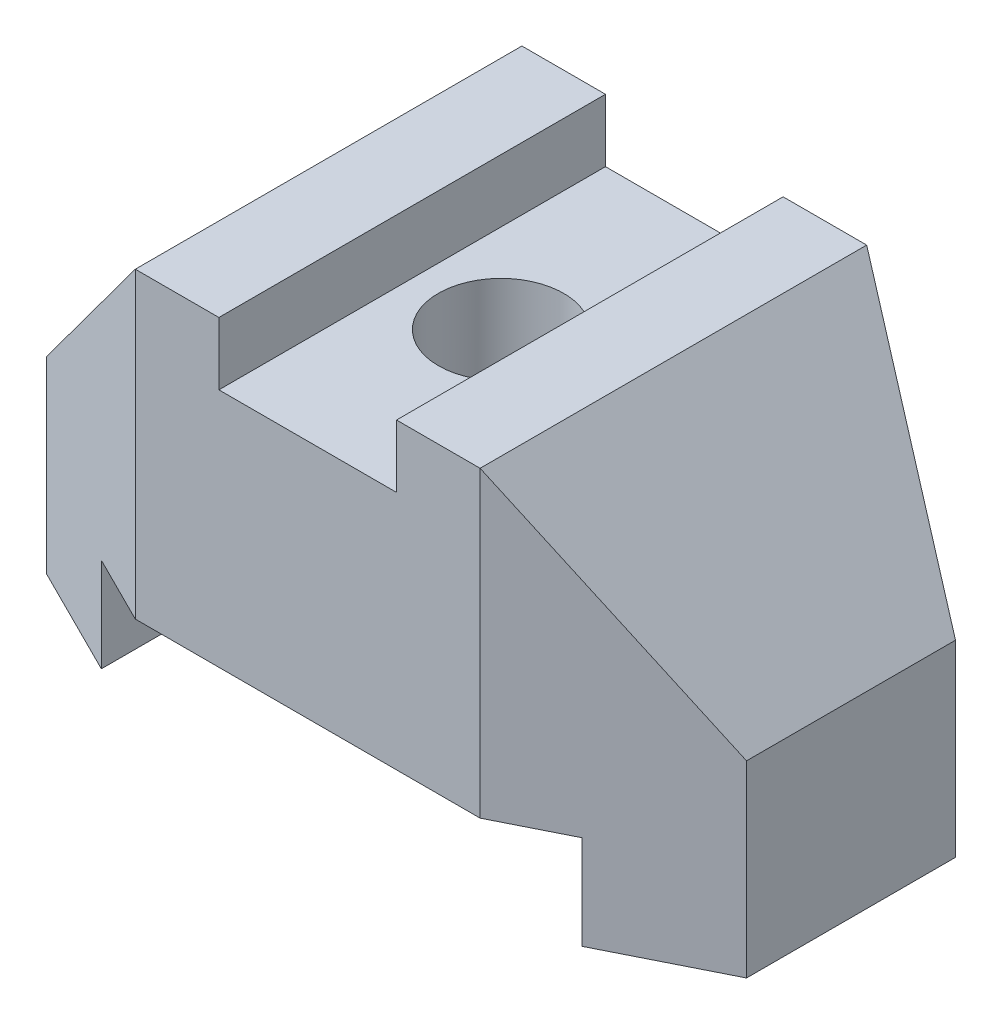
ISO-10303-21;
HEADER;
FILE_DESCRIPTION(('STEP AP214'),'2;1');
FILE_NAME('part.step','',(''),(''),'','','');
FILE_SCHEMA(('AUTOMOTIVE_DESIGN { 1 0 10303 214 1 1 1 1 }'));
ENDSEC;
DATA;
#1=APPLICATION_CONTEXT('core data for automotive mechanical design processes');
#2=APPLICATION_PROTOCOL_DEFINITION('international standard','automotive_design',2000,#1);
#3=PRODUCT_CONTEXT('',#1,'mechanical');
#4=PRODUCT('Part','Part','',(#3));
#5=PRODUCT_RELATED_PRODUCT_CATEGORY('part','',(#4));
#6=PRODUCT_DEFINITION_FORMATION('','',#4);
#7=PRODUCT_DEFINITION_CONTEXT('part definition',#1,'design');
#8=PRODUCT_DEFINITION('design','',#6,#7);
#9=PRODUCT_DEFINITION_SHAPE('','',#8);
#10=(LENGTH_UNIT() NAMED_UNIT(*) SI_UNIT(.MILLI.,.METRE.));
#11=(NAMED_UNIT(*) PLANE_ANGLE_UNIT() SI_UNIT($,.RADIAN.));
#12=(NAMED_UNIT(*) SI_UNIT($,.STERADIAN.) SOLID_ANGLE_UNIT());
#13=UNCERTAINTY_MEASURE_WITH_UNIT(LENGTH_MEASURE(1.E-05),#10,'distance_accuracy_value','');
#14=(GEOMETRIC_REPRESENTATION_CONTEXT(3) GLOBAL_UNCERTAINTY_ASSIGNED_CONTEXT((#13)) GLOBAL_UNIT_ASSIGNED_CONTEXT((#10,
#11,#12)) REPRESENTATION_CONTEXT('',''));
#15=CARTESIAN_POINT('',(0.,0.,0.));
#16=DIRECTION('',(0.,0.,1.));
#17=DIRECTION('',(1.,0.,0.));
#18=AXIS2_PLACEMENT_3D('',#15,#16,#17);
#19=CARTESIAN_POINT('',(0.,38.,0.));
#20=DIRECTION('',(0.,1.,0.));
#21=DIRECTION('',(0.,0.,1.));
#22=AXIS2_PLACEMENT_3D('',#19,#20,#21);
#23=PLANE('',#22);
#24=DIRECTION('',(0.,0.,-1.));
#25=VECTOR('',#24,1.);
#26=CARTESIAN_POINT('',(8.5,38.,-18.5));
#27=LINE('',#26,#25);
#28=CARTESIAN_POINT('',(8.49999999999999,38.,18.5));
#29=VERTEX_POINT('',#28);
#30=CARTESIAN_POINT('',(8.5,38.,-18.5));
#31=VERTEX_POINT('',#30);
#32=EDGE_CURVE('E172',#29,#31,#27,.T.);
#33=ORIENTED_EDGE('',*,*,#32,.F.);
#34=DIRECTION('',(1.,0.,0.));
#35=VECTOR('',#34,1.);
#36=CARTESIAN_POINT('',(0.,38.,18.5));
#37=LINE('',#36,#35);
#38=CARTESIAN_POINT('',(16.5,38.,18.5));
#39=VERTEX_POINT('',#38);
#40=EDGE_CURVE('E256',#29,#39,#37,.T.);
#41=ORIENTED_EDGE('',*,*,#40,.T.);
#42=DIRECTION('',(0.,0.,-1.));
#43=VECTOR('',#42,1.);
#44=CARTESIAN_POINT('',(16.5,38.,119.314675957941));
#45=LINE('',#44,#43);
#46=CARTESIAN_POINT('',(16.5,38.,-18.5));
#47=VERTEX_POINT('',#46);
#48=EDGE_CURVE('E238',#39,#47,#45,.T.);
#49=ORIENTED_EDGE('',*,*,#48,.T.);
#50=DIRECTION('',(1.,0.,0.));
#51=VECTOR('',#50,1.);
#52=CARTESIAN_POINT('',(0.,38.,-18.5));
#53=LINE('',#52,#51);
#54=EDGE_CURVE('E255',#31,#47,#53,.T.);
#55=ORIENTED_EDGE('',*,*,#54,.F.);
#56=EDGE_LOOP('',(#33,#41,#49,#55));
#57=FACE_BOUND('',#56,.T.);
#58=ADVANCED_FACE('F41',(#57),#23,.T.);
#59=CARTESIAN_POINT('',(0.,0.,0.));
#60=DIRECTION('',(0.,1.,0.));
#61=DIRECTION('',(0.,0.,1.));
#62=AXIS2_PLACEMENT_3D('',#59,#60,#61);
#63=PLANE('',#62);
#64=DIRECTION('',(0.894427190999916,0.,-0.447213595499958));
#65=VECTOR('',#64,1.);
#66=CARTESIAN_POINT('',(-10.7,0.,-21.4));
#67=LINE('',#66,#65);
#68=CARTESIAN_POINT('',(-33.5,0.,-10.));
#69=VERTEX_POINT('',#68);
#70=CARTESIAN_POINT('',(-23.,0.,-15.25));
#71=VERTEX_POINT('',#70);
#72=EDGE_CURVE('E279',#69,#71,#67,.T.);
#73=ORIENTED_EDGE('',*,*,#72,.T.);
#74=DIRECTION('',(0.,0.,1.));
#75=VECTOR('',#74,1.);
#76=CARTESIAN_POINT('',(-23.,0.,0.));
#77=LINE('',#76,#75);
#78=CARTESIAN_POINT('',(-23.,0.,15.25));
#79=VERTEX_POINT('',#78);
#80=EDGE_CURVE('E50',#71,#79,#77,.T.);
#81=ORIENTED_EDGE('',*,*,#80,.T.);
#82=DIRECTION('',(0.894427190999916,0.,0.447213595499958));
#83=VECTOR('',#82,1.);
#84=CARTESIAN_POINT('',(-10.7,0.,21.4));
#85=LINE('',#84,#83);
#86=CARTESIAN_POINT('',(-33.5,0.,10.));
#87=VERTEX_POINT('',#86);
#88=EDGE_CURVE('E263',#87,#79,#85,.T.);
#89=ORIENTED_EDGE('',*,*,#88,.F.);
#90=DIRECTION('',(0.,0.,-1.));
#91=VECTOR('',#90,1.);
#92=CARTESIAN_POINT('',(-33.5,0.,0.));
#93=LINE('',#92,#91);
#94=EDGE_CURVE('E250',#87,#69,#93,.T.);
#95=ORIENTED_EDGE('',*,*,#94,.T.);
#96=EDGE_LOOP('',(#73,#81,#89,#95));
#97=FACE_BOUND('',#96,.T.);
#98=ADVANCED_FACE('F324',(#97),#63,.F.);
#99=CARTESIAN_POINT('',(-33.5,38.,0.));
#100=DIRECTION('',(-1.,0.,0.));
#101=DIRECTION('',(0.,0.,1.));
#102=AXIS2_PLACEMENT_3D('',#99,#100,#101);
#103=PLANE('',#102);
#104=DIRECTION('',(0.,-1.,0.));
#105=VECTOR('',#104,1.);
#106=CARTESIAN_POINT('',(-33.5,38.,10.));
#107=LINE('',#106,#105);
#108=CARTESIAN_POINT('',(-33.5,18.,10.));
#109=VERTEX_POINT('',#108);
#110=EDGE_CURVE('E307',#109,#87,#107,.T.);
#111=ORIENTED_EDGE('',*,*,#110,.F.);
#112=DIRECTION('',(0.,0.,-1.));
#113=VECTOR('',#112,1.);
#114=CARTESIAN_POINT('',(-33.5,18.,119.314675957941));
#115=LINE('',#114,#113);
#116=CARTESIAN_POINT('',(-33.5,18.,-10.));
#117=VERTEX_POINT('',#116);
#118=EDGE_CURVE('E228',#109,#117,#115,.T.);
#119=ORIENTED_EDGE('',*,*,#118,.T.);
#120=DIRECTION('',(0.,-1.,0.));
#121=VECTOR('',#120,1.);
#122=CARTESIAN_POINT('',(-33.5,38.,-10.));
#123=LINE('',#122,#121);
#124=EDGE_CURVE('E259',#117,#69,#123,.T.);
#125=ORIENTED_EDGE('',*,*,#124,.T.);
#126=ORIENTED_EDGE('',*,*,#94,.F.);
#127=EDGE_LOOP('',(#111,#119,#125,#126));
#128=FACE_BOUND('',#127,.T.);
#129=ADVANCED_FACE('F43',(#128),#103,.T.);
#130=CARTESIAN_POINT('',(33.5,38.,0.));
#131=DIRECTION('',(-1.,0.,0.));
#132=DIRECTION('',(0.,0.,1.));
#133=AXIS2_PLACEMENT_3D('',#130,#131,#132);
#134=PLANE('',#133);
#135=DIRECTION('',(0.,0.,-1.));
#136=VECTOR('',#135,1.);
#137=CARTESIAN_POINT('',(33.5,18.,119.314675957941));
#138=LINE('',#137,#136);
#139=CARTESIAN_POINT('',(33.5,18.,10.));
#140=VERTEX_POINT('',#139);
#141=CARTESIAN_POINT('',(33.5,18.,-10.));
#142=VERTEX_POINT('',#141);
#143=EDGE_CURVE('E239',#140,#142,#138,.T.);
#144=ORIENTED_EDGE('',*,*,#143,.F.);
#145=DIRECTION('',(0.,-1.,0.));
#146=VECTOR('',#145,1.);
#147=CARTESIAN_POINT('',(33.5,38.,10.));
#148=LINE('',#147,#146);
#149=CARTESIAN_POINT('',(33.5,0.,10.));
#150=VERTEX_POINT('',#149);
#151=EDGE_CURVE('E296',#140,#150,#148,.T.);
#152=ORIENTED_EDGE('',*,*,#151,.T.);
#153=DIRECTION('',(0.,0.,-1.));
#154=VECTOR('',#153,1.);
#155=CARTESIAN_POINT('',(33.5,0.,0.));
#156=LINE('',#155,#154);
#157=CARTESIAN_POINT('',(33.5,0.,-10.));
#158=VERTEX_POINT('',#157);
#159=EDGE_CURVE('E271',#150,#158,#156,.T.);
#160=ORIENTED_EDGE('',*,*,#159,.T.);
#161=DIRECTION('',(0.,-1.,0.));
#162=VECTOR('',#161,1.);
#163=CARTESIAN_POINT('',(33.5,38.,-10.));
#164=LINE('',#163,#162);
#165=EDGE_CURVE('E293',#142,#158,#164,.T.);
#166=ORIENTED_EDGE('',*,*,#165,.F.);
#167=EDGE_LOOP('',(#144,#152,#160,#166));
#168=FACE_BOUND('',#167,.T.);
#169=ADVANCED_FACE('F381',(#168),#134,.F.);
#170=DIRECTION('',(0.,0.,1.));
#171=VECTOR('',#170,1.);
#172=CARTESIAN_POINT('',(-8.5,38.,-18.5));
#173=LINE('',#172,#171);
#174=CARTESIAN_POINT('',(-8.5,38.,-18.5));
#175=VERTEX_POINT('',#174);
#176=CARTESIAN_POINT('',(-8.49999999999999,38.,18.5));
#177=VERTEX_POINT('',#176);
#178=EDGE_CURVE('E343',#175,#177,#173,.T.);
#179=ORIENTED_EDGE('',*,*,#178,.F.);
#180=CARTESIAN_POINT('',(-16.5,38.,-18.5));
#181=VERTEX_POINT('',#180);
#182=EDGE_CURVE('E178',#181,#175,#53,.T.);
#183=ORIENTED_EDGE('',*,*,#182,.F.);
#184=DIRECTION('',(0.,0.,-1.));
#185=VECTOR('',#184,1.);
#186=CARTESIAN_POINT('',(-16.5,38.,119.314675957941));
#187=LINE('',#186,#185);
#188=CARTESIAN_POINT('',(-16.5,38.,18.5));
#189=VERTEX_POINT('',#188);
#190=EDGE_CURVE('E227',#189,#181,#187,.T.);
#191=ORIENTED_EDGE('',*,*,#190,.F.);
#192=EDGE_CURVE('E251',#189,#177,#37,.T.);
#193=ORIENTED_EDGE('',*,*,#192,.T.);
#194=EDGE_LOOP('',(#179,#183,#191,#193));
#195=FACE_BOUND('',#194,.T.);
#196=ADVANCED_FACE('F342',(#195),#23,.T.);
#197=CARTESIAN_POINT('',(10.7,38.,21.4));
#198=DIRECTION('',(0.447213595499958,0.,0.894427190999916));
#199=DIRECTION('',(0.894427190999916,0.,-0.447213595499958));
#200=AXIS2_PLACEMENT_3D('',#197,#198,#199);
#201=PLANE('',#200);
#202=DIRECTION('',(-0.894427190999916,0.,0.447213595499958));
#203=VECTOR('',#202,1.);
#204=CARTESIAN_POINT('',(10.7,9.00000000000002,21.4));
#205=LINE('',#204,#203);
#206=CARTESIAN_POINT('',(23.,9.00000000000003,15.25));
#207=VERTEX_POINT('',#206);
#208=CARTESIAN_POINT('',(16.5,9.00000000000002,18.5));
#209=VERTEX_POINT('',#208);
#210=EDGE_CURVE('E224',#207,#209,#205,.T.);
#211=ORIENTED_EDGE('',*,*,#210,.F.);
#212=DIRECTION('',(0.,1.,0.));
#213=VECTOR('',#212,1.);
#214=CARTESIAN_POINT('',(23.,38.,15.25));
#215=LINE('',#214,#213);
#216=CARTESIAN_POINT('',(23.,0.,15.25));
#217=VERTEX_POINT('',#216);
#218=EDGE_CURVE('E206',#217,#207,#215,.T.);
#219=ORIENTED_EDGE('',*,*,#218,.F.);
#220=DIRECTION('',(-0.894427190999916,0.,0.447213595499958));
#221=VECTOR('',#220,1.);
#222=CARTESIAN_POINT('',(10.7,0.,21.4));
#223=LINE('',#222,#221);
#224=EDGE_CURVE('E267',#150,#217,#223,.T.);
#225=ORIENTED_EDGE('',*,*,#224,.F.);
#226=ORIENTED_EDGE('',*,*,#151,.F.);
#227=DIRECTION('',(-0.616148319848837,0.72488037629275,0.308074159924419));
#228=VECTOR('',#227,1.);
#229=CARTESIAN_POINT('',(13.747619047619,41.2380952380952,19.8761904761905));
#230=LINE('',#229,#228);
#231=EDGE_CURVE('E243',#140,#39,#230,.T.);
#232=ORIENTED_EDGE('',*,*,#231,.T.);
#233=DIRECTION('',(0.,-1.,0.));
#234=VECTOR('',#233,1.);
#235=CARTESIAN_POINT('',(16.5,38.,18.5));
#236=LINE('',#235,#234);
#237=EDGE_CURVE('E299',#39,#209,#236,.T.);
#238=ORIENTED_EDGE('',*,*,#237,.T.);
#239=EDGE_LOOP('',(#211,#219,#225,#226,#232,#238));
#240=FACE_BOUND('',#239,.T.);
#241=ADVANCED_FACE('F386',(#240),#201,.T.);
#242=CARTESIAN_POINT('',(10.7,38.,-21.4));
#243=DIRECTION('',(-0.447213595499958,0.,0.894427190999916));
#244=DIRECTION('',(0.894427190999916,0.,0.447213595499958));
#245=AXIS2_PLACEMENT_3D('',#242,#243,#244);
#246=PLANE('',#245);
#247=DIRECTION('',(0.,1.,0.));
#248=VECTOR('',#247,1.);
#249=CARTESIAN_POINT('',(23.,38.,-15.25));
#250=LINE('',#249,#248);
#251=CARTESIAN_POINT('',(23.,0.,-15.25));
#252=VERTEX_POINT('',#251);
#253=CARTESIAN_POINT('',(23.,9.00000000000003,-15.25));
#254=VERTEX_POINT('',#253);
#255=EDGE_CURVE('E65',#252,#254,#250,.T.);
#256=ORIENTED_EDGE('',*,*,#255,.T.);
#257=DIRECTION('',(-0.894427190999916,0.,-0.447213595499958));
#258=VECTOR('',#257,1.);
#259=CARTESIAN_POINT('',(10.7,9.00000000000002,-21.4));
#260=LINE('',#259,#258);
#261=CARTESIAN_POINT('',(16.5,9.00000000000002,-18.5));
#262=VERTEX_POINT('',#261);
#263=EDGE_CURVE('E220',#254,#262,#260,.T.);
#264=ORIENTED_EDGE('',*,*,#263,.T.);
#265=DIRECTION('',(0.,-1.,0.));
#266=VECTOR('',#265,1.);
#267=CARTESIAN_POINT('',(16.5,38.,-18.5));
#268=LINE('',#267,#266);
#269=EDGE_CURVE('E289',#47,#262,#268,.T.);
#270=ORIENTED_EDGE('',*,*,#269,.F.);
#271=DIRECTION('',(-0.616148319848837,0.72488037629275,-0.308074159924419));
#272=VECTOR('',#271,1.);
#273=CARTESIAN_POINT('',(13.747619047619,41.2380952380952,-19.8761904761905));
#274=LINE('',#273,#272);
#275=EDGE_CURVE('E310',#142,#47,#274,.T.);
#276=ORIENTED_EDGE('',*,*,#275,.F.);
#277=ORIENTED_EDGE('',*,*,#165,.T.);
#278=DIRECTION('',(-0.894427190999916,0.,-0.447213595499958));
#279=VECTOR('',#278,1.);
#280=CARTESIAN_POINT('',(10.7,0.,-21.4));
#281=LINE('',#280,#279);
#282=EDGE_CURVE('E275',#158,#252,#281,.T.);
#283=ORIENTED_EDGE('',*,*,#282,.T.);
#284=EDGE_LOOP('',(#256,#264,#270,#276,#277,#283));
#285=FACE_BOUND('',#284,.T.);
#286=ADVANCED_FACE('F374',(#285),#246,.F.);
#287=CARTESIAN_POINT('',(-10.7,38.,21.4));
#288=DIRECTION('',(0.447213595499958,0.,-0.894427190999916));
#289=DIRECTION('',(-0.894427190999916,0.,-0.447213595499958));
#290=AXIS2_PLACEMENT_3D('',#287,#288,#289);
#291=PLANE('',#290);
#292=ORIENTED_EDGE('',*,*,#88,.T.);
#293=DIRECTION('',(0.,1.,0.));
#294=VECTOR('',#293,1.);
#295=CARTESIAN_POINT('',(-23.,38.,15.25));
#296=LINE('',#295,#294);
#297=CARTESIAN_POINT('',(-23.,9.,15.25));
#298=VERTEX_POINT('',#297);
#299=EDGE_CURVE('E212',#79,#298,#296,.T.);
#300=ORIENTED_EDGE('',*,*,#299,.T.);
#301=DIRECTION('',(0.894427190999916,0.,0.447213595499958));
#302=VECTOR('',#301,1.);
#303=CARTESIAN_POINT('',(-10.7,9.00000000000001,21.4));
#304=LINE('',#303,#302);
#305=CARTESIAN_POINT('',(-16.5,9.,18.5));
#306=VERTEX_POINT('',#305);
#307=EDGE_CURVE('E216',#298,#306,#304,.T.);
#308=ORIENTED_EDGE('',*,*,#307,.T.);
#309=DIRECTION('',(0.,-1.,0.));
#310=VECTOR('',#309,1.);
#311=CARTESIAN_POINT('',(-16.5,38.,18.5));
#312=LINE('',#311,#310);
#313=EDGE_CURVE('E303',#189,#306,#312,.T.);
#314=ORIENTED_EDGE('',*,*,#313,.F.);
#315=DIRECTION('',(-0.616148319848837,-0.72488037629275,-0.308074159924419));
#316=VECTOR('',#315,1.);
#317=CARTESIAN_POINT('',(-13.747619047619,41.2380952380952,19.8761904761905));
#318=LINE('',#317,#316);
#319=EDGE_CURVE('E232',#189,#109,#318,.T.);
#320=ORIENTED_EDGE('',*,*,#319,.T.);
#321=ORIENTED_EDGE('',*,*,#110,.T.);
#322=EDGE_LOOP('',(#292,#300,#308,#314,#320,#321));
#323=FACE_BOUND('',#322,.T.);
#324=ADVANCED_FACE('F330',(#323),#291,.F.);
#325=CARTESIAN_POINT('',(0.,38.,18.5));
#326=DIRECTION('',(0.,0.,-1.));
#327=DIRECTION('',(-1.,0.,0.));
#328=AXIS2_PLACEMENT_3D('',#325,#326,#327);
#329=PLANE('',#328);
#330=ORIENTED_EDGE('',*,*,#40,.F.);
#331=DIRECTION('',(0.,1.,0.));
#332=VECTOR('',#331,1.);
#333=CARTESIAN_POINT('',(8.49999999999999,32.,18.5));
#334=LINE('',#333,#332);
#335=CARTESIAN_POINT('',(8.49999999999999,32.,18.5));
#336=VERTEX_POINT('',#335);
#337=EDGE_CURVE('E183',#336,#29,#334,.T.);
#338=ORIENTED_EDGE('',*,*,#337,.F.);
#339=DIRECTION('',(1.,0.,0.));
#340=VECTOR('',#339,1.);
#341=CARTESIAN_POINT('',(-8.49999999999999,32.,18.5));
#342=LINE('',#341,#340);
#343=CARTESIAN_POINT('',(-8.49999999999999,32.,18.5));
#344=VERTEX_POINT('',#343);
#345=EDGE_CURVE('E164',#344,#336,#342,.T.);
#346=ORIENTED_EDGE('',*,*,#345,.F.);
#347=DIRECTION('',(0.,1.,0.));
#348=VECTOR('',#347,1.);
#349=CARTESIAN_POINT('',(-8.49999999999999,32.,18.5));
#350=LINE('',#349,#348);
#351=EDGE_CURVE('E161',#344,#177,#350,.T.);
#352=ORIENTED_EDGE('',*,*,#351,.T.);
#353=ORIENTED_EDGE('',*,*,#192,.F.);
#354=ORIENTED_EDGE('',*,*,#313,.T.);
#355=DIRECTION('',(-1.,0.,0.));
#356=VECTOR('',#355,1.);
#357=CARTESIAN_POINT('',(-23.,9.,18.5));
#358=LINE('',#357,#356);
#359=EDGE_CURVE('E188',#209,#306,#358,.T.);
#360=ORIENTED_EDGE('',*,*,#359,.F.);
#361=ORIENTED_EDGE('',*,*,#237,.F.);
#362=EDGE_LOOP('',(#330,#338,#346,#352,#353,#354,#360,#361));
#363=FACE_BOUND('',#362,.T.);
#364=ADVANCED_FACE('F367',(#363),#329,.F.);
#365=CARTESIAN_POINT('',(0.,38.,-18.5));
#366=DIRECTION('',(0.,0.,-1.));
#367=DIRECTION('',(-1.,0.,0.));
#368=AXIS2_PLACEMENT_3D('',#365,#366,#367);
#369=PLANE('',#368);
#370=DIRECTION('',(0.,1.,0.));
#371=VECTOR('',#370,1.);
#372=CARTESIAN_POINT('',(8.5,32.,-18.5));
#373=LINE('',#372,#371);
#374=CARTESIAN_POINT('',(8.5,32.,-18.5));
#375=VERTEX_POINT('',#374);
#376=EDGE_CURVE('E192',#375,#31,#373,.T.);
#377=ORIENTED_EDGE('',*,*,#376,.T.);
#378=ORIENTED_EDGE('',*,*,#54,.T.);
#379=ORIENTED_EDGE('',*,*,#269,.T.);
#380=DIRECTION('',(-1.,0.,0.));
#381=VECTOR('',#380,1.);
#382=CARTESIAN_POINT('',(-23.,9.,-18.5));
#383=LINE('',#382,#381);
#384=CARTESIAN_POINT('',(-16.5,9.,-18.5));
#385=VERTEX_POINT('',#384);
#386=EDGE_CURVE('E191',#262,#385,#383,.T.);
#387=ORIENTED_EDGE('',*,*,#386,.T.);
#388=DIRECTION('',(0.,-1.,0.));
#389=VECTOR('',#388,1.);
#390=CARTESIAN_POINT('',(-16.5,38.,-18.5));
#391=LINE('',#390,#389);
#392=EDGE_CURVE('E285',#181,#385,#391,.T.);
#393=ORIENTED_EDGE('',*,*,#392,.F.);
#394=ORIENTED_EDGE('',*,*,#182,.T.);
#395=DIRECTION('',(0.,1.,0.));
#396=VECTOR('',#395,1.);
#397=CARTESIAN_POINT('',(-8.5,32.,-18.5));
#398=LINE('',#397,#396);
#399=CARTESIAN_POINT('',(-8.5,32.,-18.5));
#400=VERTEX_POINT('',#399);
#401=EDGE_CURVE('E158',#400,#175,#398,.T.);
#402=ORIENTED_EDGE('',*,*,#401,.F.);
#403=DIRECTION('',(-1.,0.,0.));
#404=VECTOR('',#403,1.);
#405=CARTESIAN_POINT('',(-8.5,32.,-18.5));
#406=LINE('',#405,#404);
#407=EDGE_CURVE('E165',#375,#400,#406,.T.);
#408=ORIENTED_EDGE('',*,*,#407,.F.);
#409=EDGE_LOOP('',(#377,#378,#379,#387,#393,#394,#402,#408));
#410=FACE_BOUND('',#409,.T.);
#411=ADVANCED_FACE('F175',(#410),#369,.T.);
#412=CARTESIAN_POINT('',(-10.7,38.,-21.4));
#413=DIRECTION('',(-0.447213595499958,0.,-0.894427190999916));
#414=DIRECTION('',(-0.894427190999916,0.,0.447213595499958));
#415=AXIS2_PLACEMENT_3D('',#412,#413,#414);
#416=PLANE('',#415);
#417=DIRECTION('',(0.,1.,0.));
#418=VECTOR('',#417,1.);
#419=CARTESIAN_POINT('',(-23.,38.,-15.25));
#420=LINE('',#419,#418);
#421=CARTESIAN_POINT('',(-23.,9.,-15.25));
#422=VERTEX_POINT('',#421);
#423=EDGE_CURVE('E209',#71,#422,#420,.T.);
#424=ORIENTED_EDGE('',*,*,#423,.F.);
#425=ORIENTED_EDGE('',*,*,#72,.F.);
#426=ORIENTED_EDGE('',*,*,#124,.F.);
#427=DIRECTION('',(-0.616148319848837,-0.72488037629275,0.308074159924419));
#428=VECTOR('',#427,1.);
#429=CARTESIAN_POINT('',(-13.747619047619,41.2380952380952,-19.8761904761905));
#430=LINE('',#429,#428);
#431=EDGE_CURVE('E314',#181,#117,#430,.T.);
#432=ORIENTED_EDGE('',*,*,#431,.F.);
#433=ORIENTED_EDGE('',*,*,#392,.T.);
#434=DIRECTION('',(0.894427190999916,0.,-0.447213595499958));
#435=VECTOR('',#434,1.);
#436=CARTESIAN_POINT('',(-10.7,9.00000000000001,-21.4));
#437=LINE('',#436,#435);
#438=EDGE_CURVE('E11',#422,#385,#437,.T.);
#439=ORIENTED_EDGE('',*,*,#438,.F.);
#440=EDGE_LOOP('',(#424,#425,#426,#432,#433,#439));
#441=FACE_BOUND('',#440,.T.);
#442=ADVANCED_FACE('F339',(#441),#416,.T.);
#443=ORIENTED_EDGE('',*,*,#224,.T.);
#444=DIRECTION('',(0.,0.,-1.));
#445=VECTOR('',#444,1.);
#446=CARTESIAN_POINT('',(23.,0.,0.));
#447=LINE('',#446,#445);
#448=EDGE_CURVE('E318',#217,#252,#447,.T.);
#449=ORIENTED_EDGE('',*,*,#448,.T.);
#450=ORIENTED_EDGE('',*,*,#282,.F.);
#451=ORIENTED_EDGE('',*,*,#159,.F.);
#452=EDGE_LOOP('',(#443,#449,#450,#451));
#453=FACE_BOUND('',#452,.T.);
#454=ADVANCED_FACE('F389',(#453),#63,.F.);
#455=CARTESIAN_POINT('',(16.5,38.,119.314675957941));
#456=DIRECTION('',(0.761939317759459,0.64764842009554,0.));
#457=DIRECTION('',(-0.64764842009554,0.76193931775946,0.));
#458=AXIS2_PLACEMENT_3D('',#455,#456,#457);
#459=PLANE('',#458);
#460=ORIENTED_EDGE('',*,*,#231,.F.);
#461=ORIENTED_EDGE('',*,*,#143,.T.);
#462=ORIENTED_EDGE('',*,*,#275,.T.);
#463=ORIENTED_EDGE('',*,*,#48,.F.);
#464=EDGE_LOOP('',(#460,#461,#462,#463));
#465=FACE_BOUND('',#464,.T.);
#466=ADVANCED_FACE('F378',(#465),#459,.T.);
#467=CARTESIAN_POINT('',(-16.5,38.,119.314675957941));
#468=DIRECTION('',(0.761939317759459,-0.64764842009554,0.));
#469=DIRECTION('',(0.64764842009554,0.76193931775946,0.));
#470=AXIS2_PLACEMENT_3D('',#467,#468,#469);
#471=PLANE('',#470);
#472=ORIENTED_EDGE('',*,*,#319,.F.);
#473=ORIENTED_EDGE('',*,*,#190,.T.);
#474=ORIENTED_EDGE('',*,*,#431,.T.);
#475=ORIENTED_EDGE('',*,*,#118,.F.);
#476=EDGE_LOOP('',(#472,#473,#474,#475));
#477=FACE_BOUND('',#476,.T.);
#478=ADVANCED_FACE('F337',(#477),#471,.F.);
#479=CARTESIAN_POINT('',(-23.,9.,-18.5));
#480=DIRECTION('',(0.,1.,0.));
#481=DIRECTION('',(-1.,0.,0.));
#482=AXIS2_PLACEMENT_3D('',#479,#480,#481);
#483=PLANE('',#482);
#484=CARTESIAN_POINT('',(0.,9.00000000000001,0.));
#485=DIRECTION('',(0.,1.,0.));
#486=DIRECTION('',(-1.,0.,0.));
#487=AXIS2_PLACEMENT_3D('',#484,#485,#486);
#488=CIRCLE('',#487,6.);
#489=CARTESIAN_POINT('',(-6.,9.00000000000001,0.));
#490=VERTEX_POINT('',#489);
#491=EDGE_CURVE('E346',#490,#490,#488,.T.);
#492=ORIENTED_EDGE('',*,*,#491,.T.);
#493=EDGE_LOOP('',(#492));
#494=FACE_BOUND('',#493,.T.);
#495=ORIENTED_EDGE('',*,*,#210,.T.);
#496=ORIENTED_EDGE('',*,*,#359,.T.);
#497=ORIENTED_EDGE('',*,*,#307,.F.);
#498=DIRECTION('',(0.,0.,1.));
#499=VECTOR('',#498,1.);
#500=CARTESIAN_POINT('',(-23.,9.,-18.5));
#501=LINE('',#500,#499);
#502=EDGE_CURVE('E197',#422,#298,#501,.T.);
#503=ORIENTED_EDGE('',*,*,#502,.F.);
#504=ORIENTED_EDGE('',*,*,#438,.T.);
#505=ORIENTED_EDGE('',*,*,#386,.F.);
#506=ORIENTED_EDGE('',*,*,#263,.F.);
#507=DIRECTION('',(0.,0.,1.));
#508=VECTOR('',#507,1.);
#509=CARTESIAN_POINT('',(23.,9.00000000000003,-18.5));
#510=LINE('',#509,#508);
#511=EDGE_CURVE('E196',#254,#207,#510,.T.);
#512=ORIENTED_EDGE('',*,*,#511,.T.);
#513=EDGE_LOOP('',(#495,#496,#497,#503,#504,#505,#506,#512));
#514=FACE_BOUND('',#513,.T.);
#515=ADVANCED_FACE('F393',(#494,#514),#483,.F.);
#516=CARTESIAN_POINT('',(-23.,0.,-18.5));
#517=DIRECTION('',(-1.,0.,0.));
#518=DIRECTION('',(0.,-1.,0.));
#519=AXIS2_PLACEMENT_3D('',#516,#517,#518);
#520=PLANE('',#519);
#521=ORIENTED_EDGE('',*,*,#80,.F.);
#522=ORIENTED_EDGE('',*,*,#423,.T.);
#523=ORIENTED_EDGE('',*,*,#502,.T.);
#524=ORIENTED_EDGE('',*,*,#299,.F.);
#525=EDGE_LOOP('',(#521,#522,#523,#524));
#526=FACE_BOUND('',#525,.T.);
#527=ADVANCED_FACE('F395',(#526),#520,.F.);
#528=CARTESIAN_POINT('',(23.,0.,-18.5));
#529=DIRECTION('',(1.,0.,0.));
#530=DIRECTION('',(0.,1.,0.));
#531=AXIS2_PLACEMENT_3D('',#528,#529,#530);
#532=PLANE('',#531);
#533=ORIENTED_EDGE('',*,*,#218,.T.);
#534=ORIENTED_EDGE('',*,*,#511,.F.);
#535=ORIENTED_EDGE('',*,*,#255,.F.);
#536=ORIENTED_EDGE('',*,*,#448,.F.);
#537=EDGE_LOOP('',(#533,#534,#535,#536));
#538=FACE_BOUND('',#537,.T.);
#539=ADVANCED_FACE('F391',(#538),#532,.F.);
#540=CARTESIAN_POINT('',(8.5,32.,-18.5));
#541=DIRECTION('',(1.,0.,0.));
#542=DIRECTION('',(0.,0.,-1.));
#543=AXIS2_PLACEMENT_3D('',#540,#541,#542);
#544=PLANE('',#543);
#545=ORIENTED_EDGE('',*,*,#32,.T.);
#546=ORIENTED_EDGE('',*,*,#376,.F.);
#547=DIRECTION('',(0.,0.,-1.));
#548=VECTOR('',#547,1.);
#549=CARTESIAN_POINT('',(8.5,32.,-18.5));
#550=LINE('',#549,#548);
#551=EDGE_CURVE('E57',#336,#375,#550,.T.);
#552=ORIENTED_EDGE('',*,*,#551,.F.);
#553=ORIENTED_EDGE('',*,*,#337,.T.);
#554=EDGE_LOOP('',(#545,#546,#552,#553));
#555=FACE_BOUND('',#554,.T.);
#556=ADVANCED_FACE('F361',(#555),#544,.F.);
#557=CARTESIAN_POINT('',(-8.5,32.,-18.5));
#558=DIRECTION('',(-1.,0.,0.));
#559=DIRECTION('',(0.,0.,1.));
#560=AXIS2_PLACEMENT_3D('',#557,#558,#559);
#561=PLANE('',#560);
#562=ORIENTED_EDGE('',*,*,#178,.T.);
#563=ORIENTED_EDGE('',*,*,#351,.F.);
#564=DIRECTION('',(0.,0.,1.));
#565=VECTOR('',#564,1.);
#566=CARTESIAN_POINT('',(-8.5,32.,-18.5));
#567=LINE('',#566,#565);
#568=EDGE_CURVE('E155',#400,#344,#567,.T.);
#569=ORIENTED_EDGE('',*,*,#568,.F.);
#570=ORIENTED_EDGE('',*,*,#401,.T.);
#571=EDGE_LOOP('',(#562,#563,#569,#570));
#572=FACE_BOUND('',#571,.T.);
#573=ADVANCED_FACE('F156',(#572),#561,.F.);
#574=CARTESIAN_POINT('',(0.,32.,0.));
#575=DIRECTION('',(0.,-1.,0.));
#576=DIRECTION('',(0.,0.,-1.));
#577=AXIS2_PLACEMENT_3D('',#574,#575,#576);
#578=PLANE('',#577);
#579=CARTESIAN_POINT('',(0.,32.,0.));
#580=DIRECTION('',(0.,1.,0.));
#581=DIRECTION('',(0.,0.,1.));
#582=AXIS2_PLACEMENT_3D('',#579,#580,#581);
#583=CIRCLE('',#582,6.);
#584=CARTESIAN_POINT('',(0.,32.,6.));
#585=VERTEX_POINT('',#584);
#586=EDGE_CURVE('E352',#585,#585,#583,.T.);
#587=ORIENTED_EDGE('',*,*,#586,.F.);
#588=EDGE_LOOP('',(#587));
#589=FACE_BOUND('',#588,.T.);
#590=ORIENTED_EDGE('',*,*,#407,.T.);
#591=ORIENTED_EDGE('',*,*,#568,.T.);
#592=ORIENTED_EDGE('',*,*,#345,.T.);
#593=ORIENTED_EDGE('',*,*,#551,.T.);
#594=EDGE_LOOP('',(#590,#591,#592,#593));
#595=FACE_BOUND('',#594,.T.);
#596=ADVANCED_FACE('F168',(#589,#595),#578,.F.);
#597=CARTESIAN_POINT('',(0.,0.,0.));
#598=DIRECTION('',(0.,1.,0.));
#599=DIRECTION('',(0.,0.,1.));
#600=AXIS2_PLACEMENT_3D('',#597,#598,#599);
#601=CYLINDRICAL_SURFACE('',#600,6.);
#602=ORIENTED_EDGE('',*,*,#586,.T.);
#603=EDGE_LOOP('',(#602));
#604=FACE_BOUND('',#603,.T.);
#605=ORIENTED_EDGE('',*,*,#491,.F.);
#606=EDGE_LOOP('',(#605));
#607=FACE_BOUND('',#606,.T.);
#608=ADVANCED_FACE('F529',(#604,#607),#601,.F.);
#609=CLOSED_SHELL('',(#58,#98,#129,#169,#196,#241,#286,#324,#364,#411,#442,#454,#466,#478,#515,
#527,#539,#556,#573,#596,#608));
#610=MANIFOLD_SOLID_BREP('B2',#609);
#611=ADVANCED_BREP_SHAPE_REPRESENTATION('',(#18,#610),#14);
#612=SHAPE_DEFINITION_REPRESENTATION(#9,#611);
ENDSEC;
END-ISO-10303-21;
